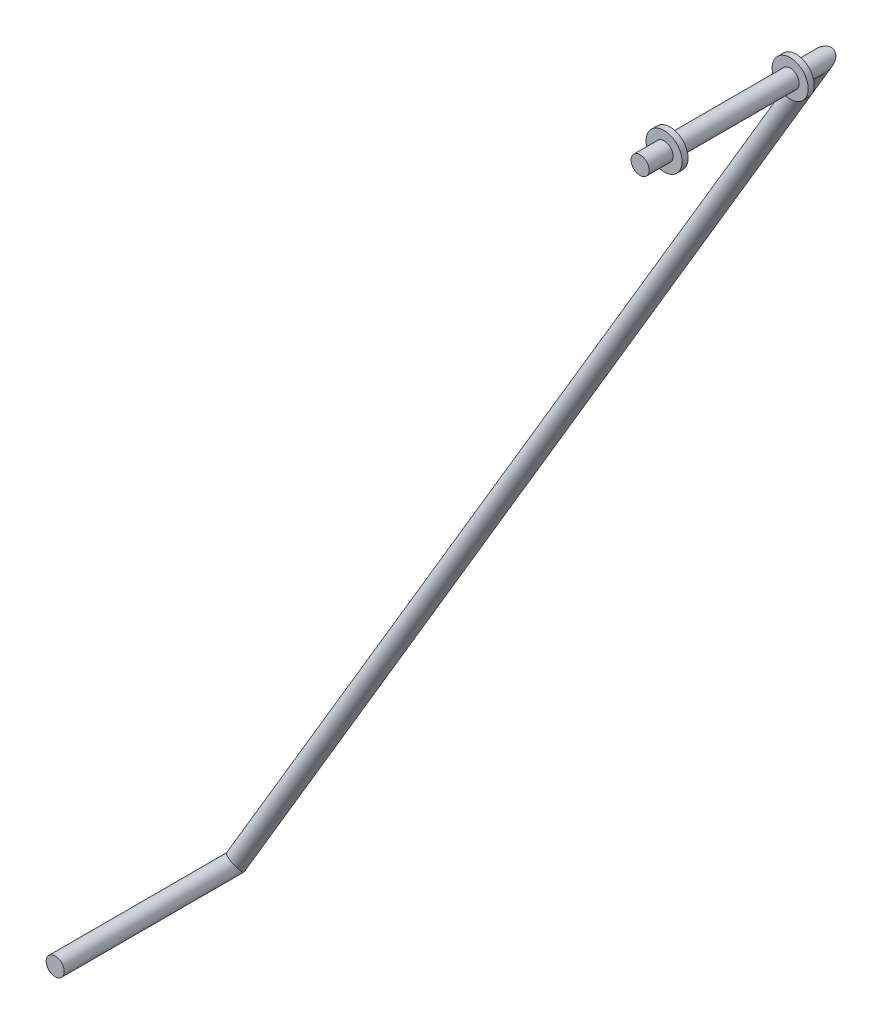
ISO-10303-21;
HEADER;
FILE_DESCRIPTION(('STEP AP214'),'2;1');
FILE_NAME('part.step','',(''),(''),'','','');
FILE_SCHEMA(('AUTOMOTIVE_DESIGN { 1 0 10303 214 1 1 1 1 }'));
ENDSEC;
DATA;
#1=APPLICATION_CONTEXT('core data for automotive mechanical design processes');
#2=APPLICATION_PROTOCOL_DEFINITION('international standard','automotive_design',2000,#1);
#3=PRODUCT_CONTEXT('',#1,'mechanical');
#4=PRODUCT('Part','Part','',(#3));
#5=PRODUCT_RELATED_PRODUCT_CATEGORY('part','',(#4));
#6=PRODUCT_DEFINITION_FORMATION('','',#4);
#7=PRODUCT_DEFINITION_CONTEXT('part definition',#1,'design');
#8=PRODUCT_DEFINITION('design','',#6,#7);
#9=PRODUCT_DEFINITION_SHAPE('','',#8);
#10=(LENGTH_UNIT() NAMED_UNIT(*) SI_UNIT(.MILLI.,.METRE.));
#11=(NAMED_UNIT(*) PLANE_ANGLE_UNIT() SI_UNIT($,.RADIAN.));
#12=(NAMED_UNIT(*) SI_UNIT($,.STERADIAN.) SOLID_ANGLE_UNIT());
#13=UNCERTAINTY_MEASURE_WITH_UNIT(LENGTH_MEASURE(1.E-05),#10,'distance_accuracy_value','');
#14=(GEOMETRIC_REPRESENTATION_CONTEXT(3) GLOBAL_UNCERTAINTY_ASSIGNED_CONTEXT((#13)) GLOBAL_UNIT_ASSIGNED_CONTEXT((#10,
#11,#12)) REPRESENTATION_CONTEXT('',''));
#15=CARTESIAN_POINT('',(0.,0.,0.));
#16=DIRECTION('',(0.,0.,1.));
#17=DIRECTION('',(1.,0.,0.));
#18=AXIS2_PLACEMENT_3D('',#15,#16,#17);
#19=CARTESIAN_POINT('',(0.,0.,-19.2426406871193));
#20=DIRECTION('',(0.,0.,1.));
#21=DIRECTION('',(1.,0.,0.));
#22=AXIS2_PLACEMENT_3D('',#19,#20,#21);
#23=CYLINDRICAL_SURFACE('',#22,1.5);
#24=CARTESIAN_POINT('',(0.,0.,-10.));
#25=DIRECTION('',(0.,0.,-1.));
#26=DIRECTION('',(0.,1.,0.));
#27=AXIS2_PLACEMENT_3D('',#24,#25,#26);
#28=CIRCLE('',#27,1.5);
#29=CARTESIAN_POINT('',(0.,1.5,-10.));
#30=VERTEX_POINT('',#29);
#31=EDGE_CURVE('E65',#30,#30,#28,.T.);
#32=ORIENTED_EDGE('',*,*,#31,.F.);
#33=EDGE_LOOP('',(#32));
#34=FACE_BOUND('',#33,.T.);
#35=CARTESIAN_POINT('',(0.,0.,10.));
#36=DIRECTION('',(0.,0.,-1.));
#37=DIRECTION('',(0.,1.,0.));
#38=AXIS2_PLACEMENT_3D('',#35,#36,#37);
#39=CIRCLE('',#38,1.5);
#40=CARTESIAN_POINT('',(0.,1.5,10.));
#41=VERTEX_POINT('',#40);
#42=EDGE_CURVE('E53',#41,#41,#39,.T.);
#43=ORIENTED_EDGE('',*,*,#42,.T.);
#44=EDGE_LOOP('',(#43));
#45=FACE_BOUND('',#44,.T.);
#46=ADVANCED_FACE('F33',(#34,#45),#23,.T.);
#47=CARTESIAN_POINT('',(0.765056538767399,1.29022807770148,10.));
#48=DIRECTION('',(0.,0.,-1.));
#49=DIRECTION('',(0.,1.,0.));
#50=AXIS2_PLACEMENT_3D('',#47,#48,#49);
#51=PLANE('',#50);
#52=CARTESIAN_POINT('',(0.,0.,10.));
#53=DIRECTION('',(0.,0.,-1.));
#54=DIRECTION('',(0.,1.,0.));
#55=AXIS2_PLACEMENT_3D('',#52,#53,#54);
#56=CIRCLE('',#55,3.);
#57=CARTESIAN_POINT('',(0.,3.,10.));
#58=VERTEX_POINT('',#57);
#59=EDGE_CURVE('E56',#58,#58,#56,.T.);
#60=ORIENTED_EDGE('',*,*,#59,.T.);
#61=EDGE_LOOP('',(#60));
#62=FACE_BOUND('',#61,.T.);
#63=ORIENTED_EDGE('',*,*,#42,.F.);
#64=EDGE_LOOP('',(#63));
#65=FACE_BOUND('',#64,.T.);
#66=ADVANCED_FACE('F96',(#62,#65),#51,.T.);
#67=CARTESIAN_POINT('',(0.,0.,-11.));
#68=DIRECTION('',(0.,0.,-1.));
#69=DIRECTION('',(0.,1.,0.));
#70=AXIS2_PLACEMENT_3D('',#67,#68,#69);
#71=CYLINDRICAL_SURFACE('',#70,3.);
#72=CARTESIAN_POINT('',(0.,0.,11.));
#73=DIRECTION('',(0.,0.,-1.));
#74=DIRECTION('',(0.,1.,0.));
#75=AXIS2_PLACEMENT_3D('',#72,#73,#74);
#76=CIRCLE('',#75,3.);
#77=CARTESIAN_POINT('',(0.,3.,11.));
#78=VERTEX_POINT('',#77);
#79=EDGE_CURVE('E59',#78,#78,#76,.T.);
#80=ORIENTED_EDGE('',*,*,#79,.T.);
#81=EDGE_LOOP('',(#80));
#82=FACE_BOUND('',#81,.T.);
#83=ORIENTED_EDGE('',*,*,#59,.F.);
#84=EDGE_LOOP('',(#83));
#85=FACE_BOUND('',#84,.T.);
#86=ADVANCED_FACE('F103',(#82,#85),#71,.T.);
#87=CARTESIAN_POINT('',(0.765056538767399,1.29022807770148,11.));
#88=DIRECTION('',(0.,0.,1.));
#89=DIRECTION('',(0.,-1.,0.));
#90=AXIS2_PLACEMENT_3D('',#87,#88,#89);
#91=PLANE('',#90);
#92=CARTESIAN_POINT('',(0.,0.,11.));
#93=DIRECTION('',(0.,0.,-1.));
#94=DIRECTION('',(0.,1.,0.));
#95=AXIS2_PLACEMENT_3D('',#92,#93,#94);
#96=CIRCLE('',#95,1.5);
#97=CARTESIAN_POINT('',(0.,1.5,11.));
#98=VERTEX_POINT('',#97);
#99=EDGE_CURVE('E62',#98,#98,#96,.T.);
#100=ORIENTED_EDGE('',*,*,#99,.T.);
#101=EDGE_LOOP('',(#100));
#102=FACE_BOUND('',#101,.T.);
#103=ORIENTED_EDGE('',*,*,#79,.F.);
#104=EDGE_LOOP('',(#103));
#105=FACE_BOUND('',#104,.T.);
#106=ADVANCED_FACE('F120',(#102,#105),#91,.T.);
#107=CARTESIAN_POINT('',(0.,0.,15.));
#108=DIRECTION('',(0.,0.,-1.));
#109=DIRECTION('',(-1.,0.,0.));
#110=AXIS2_PLACEMENT_3D('',#107,#108,#109);
#111=PLANE('',#110);
#112=CARTESIAN_POINT('',(0.,0.,15.));
#113=DIRECTION('',(0.,0.,-1.));
#114=DIRECTION('',(-1.,0.,0.));
#115=AXIS2_PLACEMENT_3D('',#112,#113,#114);
#116=CIRCLE('',#115,1.5);
#117=CARTESIAN_POINT('',(-1.5,0.,15.));
#118=VERTEX_POINT('',#117);
#119=EDGE_CURVE('E48',#118,#118,#116,.T.);
#120=ORIENTED_EDGE('',*,*,#119,.F.);
#121=EDGE_LOOP('',(#120));
#122=FACE_BOUND('',#121,.T.);
#123=ADVANCED_FACE('F112',(#122),#111,.F.);
#124=ORIENTED_EDGE('',*,*,#99,.F.);
#125=EDGE_LOOP('',(#124));
#126=FACE_BOUND('',#125,.T.);
#127=ORIENTED_EDGE('',*,*,#119,.T.);
#128=EDGE_LOOP('',(#127));
#129=FACE_BOUND('',#128,.T.);
#130=ADVANCED_FACE('F99',(#126,#129),#23,.T.);
#131=CARTESIAN_POINT('',(0.765056538767399,1.29022807770148,-10.));
#132=DIRECTION('',(0.,0.,1.));
#133=DIRECTION('',(0.,-1.,0.));
#134=AXIS2_PLACEMENT_3D('',#131,#132,#133);
#135=PLANE('',#134);
#136=ORIENTED_EDGE('',*,*,#31,.T.);
#137=EDGE_LOOP('',(#136));
#138=FACE_BOUND('',#137,.T.);
#139=CARTESIAN_POINT('',(0.,0.,-10.));
#140=DIRECTION('',(0.,0.,-1.));
#141=DIRECTION('',(0.,1.,0.));
#142=AXIS2_PLACEMENT_3D('',#139,#140,#141);
#143=CIRCLE('',#142,3.);
#144=CARTESIAN_POINT('',(0.,3.,-10.));
#145=VERTEX_POINT('',#144);
#146=EDGE_CURVE('E68',#145,#145,#143,.T.);
#147=ORIENTED_EDGE('',*,*,#146,.F.);
#148=EDGE_LOOP('',(#147));
#149=FACE_BOUND('',#148,.T.);
#150=ADVANCED_FACE('F92',(#138,#149),#135,.T.);
#151=CARTESIAN_POINT('',(0.,0.,-11.));
#152=DIRECTION('',(0.,0.,-1.));
#153=DIRECTION('',(0.,1.,0.));
#154=AXIS2_PLACEMENT_3D('',#151,#152,#153);
#155=CYLINDRICAL_SURFACE('',#154,3.);
#156=ORIENTED_EDGE('',*,*,#146,.T.);
#157=EDGE_LOOP('',(#156));
#158=FACE_BOUND('',#157,.T.);
#159=CARTESIAN_POINT('',(0.,0.,-11.));
#160=DIRECTION('',(0.,0.,-1.));
#161=DIRECTION('',(0.,1.,0.));
#162=AXIS2_PLACEMENT_3D('',#159,#160,#161);
#163=CIRCLE('',#162,3.);
#164=CARTESIAN_POINT('',(0.,3.,-11.));
#165=VERTEX_POINT('',#164);
#166=EDGE_CURVE('E71',#165,#165,#163,.T.);
#167=ORIENTED_EDGE('',*,*,#166,.F.);
#168=EDGE_LOOP('',(#167));
#169=FACE_BOUND('',#168,.T.);
#170=ADVANCED_FACE('F84',(#158,#169),#155,.T.);
#171=CARTESIAN_POINT('',(0.765056538767399,1.29022807770148,-11.));
#172=DIRECTION('',(0.,0.,-1.));
#173=DIRECTION('',(0.,1.,0.));
#174=AXIS2_PLACEMENT_3D('',#171,#172,#173);
#175=PLANE('',#174);
#176=ORIENTED_EDGE('',*,*,#166,.T.);
#177=EDGE_LOOP('',(#176));
#178=FACE_BOUND('',#177,.T.);
#179=CARTESIAN_POINT('',(0.,0.,-11.));
#180=DIRECTION('',(0.,0.,-1.));
#181=DIRECTION('',(0.,1.,0.));
#182=AXIS2_PLACEMENT_3D('',#179,#180,#181);
#183=CIRCLE('',#182,1.5);
#184=CARTESIAN_POINT('',(0.,1.5,-11.));
#185=VERTEX_POINT('',#184);
#186=EDGE_CURVE('E74',#185,#185,#183,.T.);
#187=ORIENTED_EDGE('',*,*,#186,.F.);
#188=EDGE_LOOP('',(#187));
#189=FACE_BOUND('',#188,.T.);
#190=ADVANCED_FACE('F81',(#178,#189),#175,.T.);
#191=CARTESIAN_POINT('',(-97.4173011447104,-164.289213700871,15.));
#192=DIRECTION('',(0.,0.,1.));
#193=DIRECTION('',(1.,0.,0.));
#194=AXIS2_PLACEMENT_3D('',#191,#192,#193);
#195=PLANE('',#194);
#196=CARTESIAN_POINT('',(-97.4173011447104,-164.289213700871,15.));
#197=DIRECTION('',(0.,0.,1.));
#198=DIRECTION('',(1.,0.,0.));
#199=AXIS2_PLACEMENT_3D('',#196,#197,#198);
#200=CIRCLE('',#199,1.5);
#201=CARTESIAN_POINT('',(-95.9173011447104,-164.289213700871,15.));
#202=VERTEX_POINT('',#201);
#203=EDGE_CURVE('E11',#202,#202,#200,.T.);
#204=ORIENTED_EDGE('',*,*,#203,.T.);
#205=EDGE_LOOP('',(#204));
#206=FACE_BOUND('',#205,.T.);
#207=ADVANCED_FACE('F83',(#206),#195,.T.);
#208=CARTESIAN_POINT('',(-97.4173011447104,-164.289213700871,-15.));
#209=DIRECTION('',(0.,0.,1.));
#210=DIRECTION('',(1.,0.,0.));
#211=AXIS2_PLACEMENT_3D('',#208,#209,#210);
#212=CYLINDRICAL_SURFACE('',#211,1.5);
#213=CARTESIAN_POINT('',(-97.4173011447104,-164.289213700871,-15.));
#214=DIRECTION('',(-0.360651111035691,-0.608219348679999,0.707106781186547));
#215=DIRECTION('',(-0.360651111035691,-0.608219348679998,-0.707106781186548));
#216=AXIS2_PLACEMENT_3D('',#213,#214,#215);
#217=ELLIPSE('',#216,2.12132034355964,1.5);
#218=CARTESIAN_POINT('',(-98.1823576834778,-165.579441778572,-16.5));
#219=VERTEX_POINT('',#218);
#220=EDGE_CURVE('E40',#219,#219,#217,.F.);
#221=ORIENTED_EDGE('',*,*,#220,.F.);
#222=EDGE_LOOP('',(#221));
#223=FACE_BOUND('',#222,.T.);
#224=ORIENTED_EDGE('',*,*,#203,.F.);
#225=EDGE_LOOP('',(#224));
#226=FACE_BOUND('',#225,.T.);
#227=ADVANCED_FACE('F35',(#223,#226),#212,.T.);
#228=CARTESIAN_POINT('',(0.,0.,-15.));
#229=DIRECTION('',(-0.510037692511599,-0.860152051800984,0.));
#230=DIRECTION('',(0.860152051800985,-0.510037692511599,0.));
#231=AXIS2_PLACEMENT_3D('',#228,#229,#230);
#232=CYLINDRICAL_SURFACE('',#231,1.5);
#233=CARTESIAN_POINT('',(0.,0.,-15.));
#234=DIRECTION('',(-0.360651111035691,-0.608219348679999,-0.707106781186547));
#235=DIRECTION('',(-0.360651111035691,-0.608219348679998,0.707106781186548));
#236=AXIS2_PLACEMENT_3D('',#233,#234,#235);
#237=ELLIPSE('',#236,2.12132034355964,1.5);
#238=CARTESIAN_POINT('',(-0.765056538767399,-1.29022807770148,-13.5));
#239=VERTEX_POINT('',#238);
#240=EDGE_CURVE('E44',#239,#239,#237,.T.);
#241=ORIENTED_EDGE('',*,*,#240,.T.);
#242=EDGE_LOOP('',(#241));
#243=FACE_BOUND('',#242,.T.);
#244=ORIENTED_EDGE('',*,*,#220,.T.);
#245=EDGE_LOOP('',(#244));
#246=FACE_BOUND('',#245,.T.);
#247=ADVANCED_FACE('F110',(#243,#246),#232,.T.);
#248=ORIENTED_EDGE('',*,*,#186,.T.);
#249=EDGE_LOOP('',(#248));
#250=FACE_BOUND('',#249,.T.);
#251=ORIENTED_EDGE('',*,*,#240,.F.);
#252=EDGE_LOOP('',(#251));
#253=FACE_BOUND('',#252,.T.);
#254=ADVANCED_FACE('F78',(#250,#253),#23,.T.);
#255=CLOSED_SHELL('',(#46,#66,#86,#106,#123,#130,#150,#170,#190,#207,#227,#247,#254));
#256=MANIFOLD_SOLID_BREP('B2',#255);
#257=ADVANCED_BREP_SHAPE_REPRESENTATION('',(#18,#256),#14);
#258=SHAPE_DEFINITION_REPRESENTATION(#9,#257);
ENDSEC;
END-ISO-10303-21;
